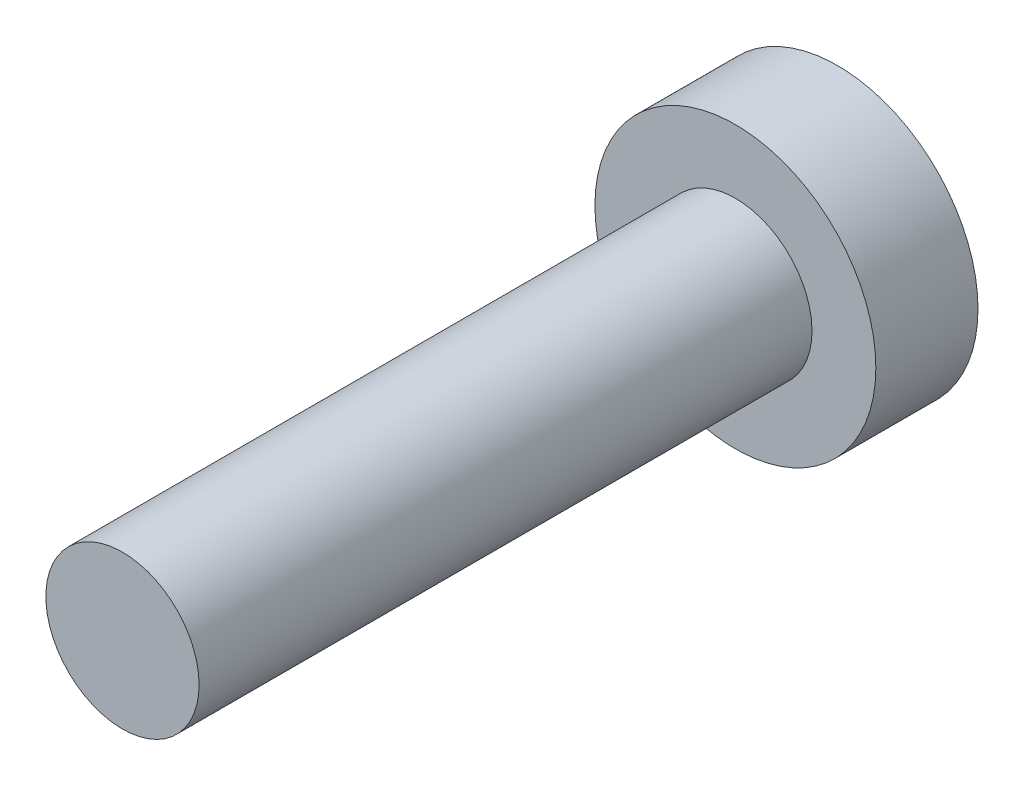
ISO-10303-21;
HEADER;
FILE_DESCRIPTION(('STEP AP214'),'2;1');
FILE_NAME('part.step','',(''),(''),'','','');
FILE_SCHEMA(('AUTOMOTIVE_DESIGN { 1 0 10303 214 1 1 1 1 }'));
ENDSEC;
DATA;
#1=APPLICATION_CONTEXT('core data for automotive mechanical design processes');
#2=APPLICATION_PROTOCOL_DEFINITION('international standard','automotive_design',2000,#1);
#3=PRODUCT_CONTEXT('',#1,'mechanical');
#4=PRODUCT('Part','Part','',(#3));
#5=PRODUCT_RELATED_PRODUCT_CATEGORY('part','',(#4));
#6=PRODUCT_DEFINITION_FORMATION('','',#4);
#7=PRODUCT_DEFINITION_CONTEXT('part definition',#1,'design');
#8=PRODUCT_DEFINITION('design','',#6,#7);
#9=PRODUCT_DEFINITION_SHAPE('','',#8);
#10=(LENGTH_UNIT() NAMED_UNIT(*) SI_UNIT(.MILLI.,.METRE.));
#11=(NAMED_UNIT(*) PLANE_ANGLE_UNIT() SI_UNIT($,.RADIAN.));
#12=(NAMED_UNIT(*) SI_UNIT($,.STERADIAN.) SOLID_ANGLE_UNIT());
#13=UNCERTAINTY_MEASURE_WITH_UNIT(LENGTH_MEASURE(1.E-05),#10,'distance_accuracy_value','');
#14=(GEOMETRIC_REPRESENTATION_CONTEXT(3) GLOBAL_UNCERTAINTY_ASSIGNED_CONTEXT((#13)) GLOBAL_UNIT_ASSIGNED_CONTEXT((#10,
#11,#12)) REPRESENTATION_CONTEXT('',''));
#15=CARTESIAN_POINT('',(0.,0.,0.));
#16=DIRECTION('',(0.,0.,1.));
#17=DIRECTION('',(1.,0.,0.));
#18=AXIS2_PLACEMENT_3D('',#15,#16,#17);
#19=CARTESIAN_POINT('',(0.,0.,0.));
#20=DIRECTION('',(0.,0.,-1.));
#21=DIRECTION('',(-1.,0.,0.));
#22=AXIS2_PLACEMENT_3D('',#19,#20,#21);
#23=CYLINDRICAL_SURFACE('',#22,2.75);
#24=CARTESIAN_POINT('',(0.,0.,0.));
#25=DIRECTION('',(0.,0.,1.));
#26=DIRECTION('',(1.,0.,0.));
#27=AXIS2_PLACEMENT_3D('',#24,#25,#26);
#28=CIRCLE('',#27,2.75);
#29=CARTESIAN_POINT('',(2.75,0.,0.));
#30=VERTEX_POINT('',#29);
#31=EDGE_CURVE('E42',#30,#30,#28,.T.);
#32=ORIENTED_EDGE('',*,*,#31,.F.);
#33=EDGE_LOOP('',(#32));
#34=FACE_BOUND('',#33,.T.);
#35=CARTESIAN_POINT('',(0.,0.,-2.));
#36=DIRECTION('',(0.,0.,1.));
#37=DIRECTION('',(1.,0.,0.));
#38=AXIS2_PLACEMENT_3D('',#35,#36,#37);
#39=CIRCLE('',#38,2.75);
#40=CARTESIAN_POINT('',(2.75,0.,-2.));
#41=VERTEX_POINT('',#40);
#42=EDGE_CURVE('E37',#41,#41,#39,.T.);
#43=ORIENTED_EDGE('',*,*,#42,.T.);
#44=EDGE_LOOP('',(#43));
#45=FACE_BOUND('',#44,.T.);
#46=ADVANCED_FACE('F40',(#34,#45),#23,.T.);
#47=CARTESIAN_POINT('',(0.,0.,0.));
#48=DIRECTION('',(0.,0.,1.));
#49=DIRECTION('',(1.,0.,0.));
#50=AXIS2_PLACEMENT_3D('',#47,#48,#49);
#51=PLANE('',#50);
#52=CARTESIAN_POINT('',(0.,0.,0.));
#53=DIRECTION('',(0.,0.,1.));
#54=DIRECTION('',(1.,0.,0.));
#55=AXIS2_PLACEMENT_3D('',#52,#53,#54);
#56=CIRCLE('',#55,1.5);
#57=CARTESIAN_POINT('',(1.5,0.,0.));
#58=VERTEX_POINT('',#57);
#59=EDGE_CURVE('E10',#58,#58,#56,.T.);
#60=ORIENTED_EDGE('',*,*,#59,.F.);
#61=EDGE_LOOP('',(#60));
#62=FACE_BOUND('',#61,.T.);
#63=ORIENTED_EDGE('',*,*,#31,.T.);
#64=EDGE_LOOP('',(#63));
#65=FACE_BOUND('',#64,.T.);
#66=ADVANCED_FACE('F63',(#62,#65),#51,.T.);
#67=CARTESIAN_POINT('',(0.,0.,-2.));
#68=DIRECTION('',(0.,0.,1.));
#69=DIRECTION('',(1.,0.,0.));
#70=AXIS2_PLACEMENT_3D('',#67,#68,#69);
#71=PLANE('',#70);
#72=ORIENTED_EDGE('',*,*,#42,.F.);
#73=EDGE_LOOP('',(#72));
#74=FACE_BOUND('',#73,.T.);
#75=ADVANCED_FACE('F59',(#74),#71,.F.);
#76=CARTESIAN_POINT('',(0.,0.,12.));
#77=DIRECTION('',(0.,0.,-1.));
#78=DIRECTION('',(-1.,0.,0.));
#79=AXIS2_PLACEMENT_3D('',#76,#77,#78);
#80=CYLINDRICAL_SURFACE('',#79,1.5);
#81=CARTESIAN_POINT('',(0.,0.,12.));
#82=DIRECTION('',(0.,0.,1.));
#83=DIRECTION('',(1.,0.,0.));
#84=AXIS2_PLACEMENT_3D('',#81,#82,#83);
#85=CIRCLE('',#84,1.5);
#86=CARTESIAN_POINT('',(1.5,0.,12.));
#87=VERTEX_POINT('',#86);
#88=EDGE_CURVE('E49',#87,#87,#85,.T.);
#89=ORIENTED_EDGE('',*,*,#88,.F.);
#90=EDGE_LOOP('',(#89));
#91=FACE_BOUND('',#90,.T.);
#92=ORIENTED_EDGE('',*,*,#59,.T.);
#93=EDGE_LOOP('',(#92));
#94=FACE_BOUND('',#93,.T.);
#95=ADVANCED_FACE('F58',(#91,#94),#80,.T.);
#96=CARTESIAN_POINT('',(0.,0.,12.));
#97=DIRECTION('',(0.,0.,1.));
#98=DIRECTION('',(1.,0.,0.));
#99=AXIS2_PLACEMENT_3D('',#96,#97,#98);
#100=PLANE('',#99);
#101=ORIENTED_EDGE('',*,*,#88,.T.);
#102=EDGE_LOOP('',(#101));
#103=FACE_BOUND('',#102,.T.);
#104=ADVANCED_FACE('F70',(#103),#100,.T.);
#105=CLOSED_SHELL('',(#46,#66,#75,#95,#104));
#106=MANIFOLD_SOLID_BREP('B2',#105);
#107=ADVANCED_BREP_SHAPE_REPRESENTATION('',(#18,#106),#14);
#108=SHAPE_DEFINITION_REPRESENTATION(#9,#107);
ENDSEC;
END-ISO-10303-21;
